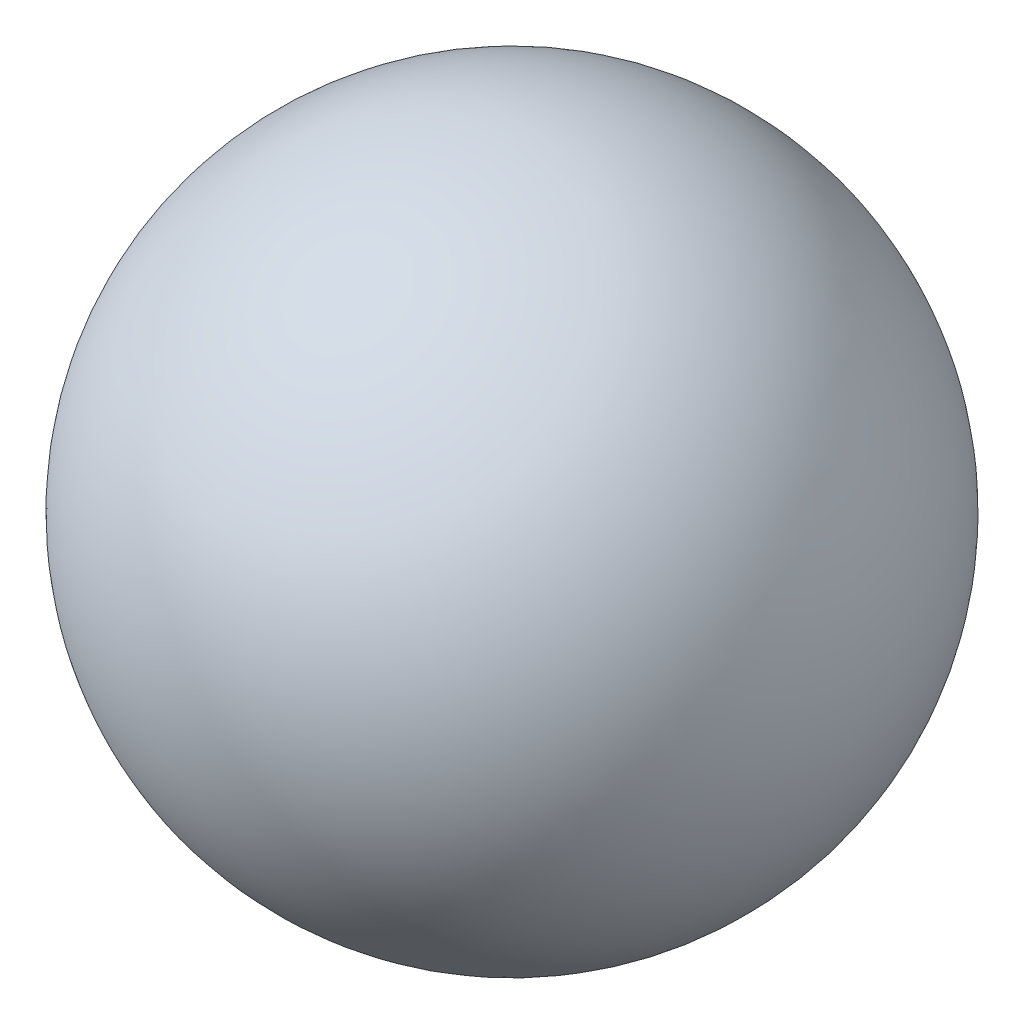
ISO-10303-21;
HEADER;
FILE_DESCRIPTION(('STEP AP214'),'2;1');
FILE_NAME('part.step','',(''),(''),'','','');
FILE_SCHEMA(('AUTOMOTIVE_DESIGN { 1 0 10303 214 1 1 1 1 }'));
ENDSEC;
DATA;
#1=APPLICATION_CONTEXT('core data for automotive mechanical design processes');
#2=APPLICATION_PROTOCOL_DEFINITION('international standard','automotive_design',2000,#1);
#3=PRODUCT_CONTEXT('',#1,'mechanical');
#4=PRODUCT('Part','Part','',(#3));
#5=PRODUCT_RELATED_PRODUCT_CATEGORY('part','',(#4));
#6=PRODUCT_DEFINITION_FORMATION('','',#4);
#7=PRODUCT_DEFINITION_CONTEXT('part definition',#1,'design');
#8=PRODUCT_DEFINITION('design','',#6,#7);
#9=PRODUCT_DEFINITION_SHAPE('','',#8);
#10=(LENGTH_UNIT() NAMED_UNIT(*) SI_UNIT(.MILLI.,.METRE.));
#11=(NAMED_UNIT(*) PLANE_ANGLE_UNIT() SI_UNIT($,.RADIAN.));
#12=(NAMED_UNIT(*) SI_UNIT($,.STERADIAN.) SOLID_ANGLE_UNIT());
#13=UNCERTAINTY_MEASURE_WITH_UNIT(LENGTH_MEASURE(1.E-05),#10,'distance_accuracy_value','');
#14=(GEOMETRIC_REPRESENTATION_CONTEXT(3) GLOBAL_UNCERTAINTY_ASSIGNED_CONTEXT((#13)) GLOBAL_UNIT_ASSIGNED_CONTEXT((#10,
#11,#12)) REPRESENTATION_CONTEXT('',''));
#15=CARTESIAN_POINT('',(0.,0.,0.));
#16=DIRECTION('',(0.,0.,1.));
#17=DIRECTION('',(1.,0.,0.));
#18=AXIS2_PLACEMENT_3D('',#15,#16,#17);
#19=CARTESIAN_POINT('',(0.,0.,0.));
#20=DIRECTION('',(0.,0.,-1.));
#21=DIRECTION('',(-1.,0.,0.));
#22=AXIS2_PLACEMENT_3D('',#19,#20,#21);
#23=SPHERICAL_SURFACE('',#22,34.25);
#24=CARTESIAN_POINT('',(0.,0.,-34.25));
#25=VERTEX_POINT('',#24);
#26=VERTEX_LOOP('',#25);
#27=FACE_BOUND('',#26,.T.);
#28=ADVANCED_FACE('F35',(#27),#23,.T.);
#29=CLOSED_SHELL('',(#28));
#30=MANIFOLD_SOLID_BREP('B2',#29);
#31=ADVANCED_BREP_SHAPE_REPRESENTATION('',(#18,#30),#14);
#32=SHAPE_DEFINITION_REPRESENTATION(#9,#31);
ENDSEC;
END-ISO-10303-21;
